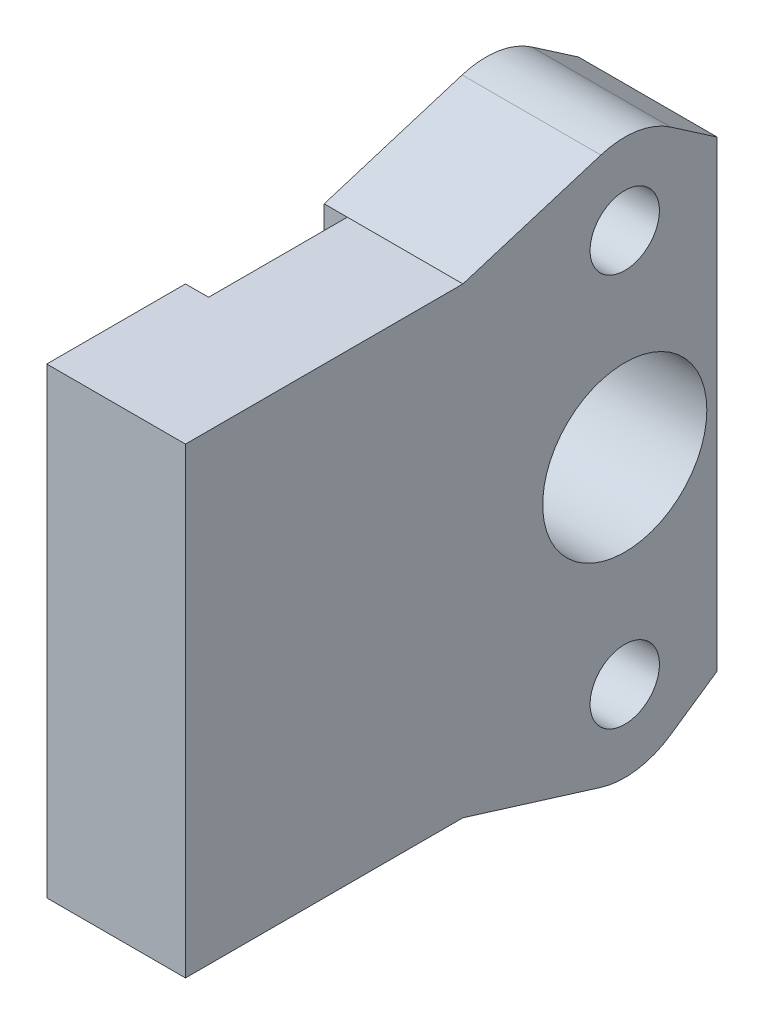
ISO-10303-21;
HEADER;
FILE_DESCRIPTION(('STEP AP214'),'2;1');
FILE_NAME('part.step','',(''),(''),'','','');
FILE_SCHEMA(('AUTOMOTIVE_DESIGN { 1 0 10303 214 1 1 1 1 }'));
ENDSEC;
DATA;
#1=APPLICATION_CONTEXT('core data for automotive mechanical design processes');
#2=APPLICATION_PROTOCOL_DEFINITION('international standard','automotive_design',2000,#1);
#3=PRODUCT_CONTEXT('',#1,'mechanical');
#4=PRODUCT('Part','Part','',(#3));
#5=PRODUCT_RELATED_PRODUCT_CATEGORY('part','',(#4));
#6=PRODUCT_DEFINITION_FORMATION('','',#4);
#7=PRODUCT_DEFINITION_CONTEXT('part definition',#1,'design');
#8=PRODUCT_DEFINITION('design','',#6,#7);
#9=PRODUCT_DEFINITION_SHAPE('','',#8);
#10=(LENGTH_UNIT() NAMED_UNIT(*) SI_UNIT(.MILLI.,.METRE.));
#11=(NAMED_UNIT(*) PLANE_ANGLE_UNIT() SI_UNIT($,.RADIAN.));
#12=(NAMED_UNIT(*) SI_UNIT($,.STERADIAN.) SOLID_ANGLE_UNIT());
#13=UNCERTAINTY_MEASURE_WITH_UNIT(LENGTH_MEASURE(1.E-05),#10,'distance_accuracy_value','');
#14=(GEOMETRIC_REPRESENTATION_CONTEXT(3) GLOBAL_UNCERTAINTY_ASSIGNED_CONTEXT((#13)) GLOBAL_UNIT_ASSIGNED_CONTEXT((#10,
#11,#12)) REPRESENTATION_CONTEXT('',''));
#15=CARTESIAN_POINT('',(0.,0.,0.));
#16=DIRECTION('',(0.,0.,1.));
#17=DIRECTION('',(1.,0.,0.));
#18=AXIS2_PLACEMENT_3D('',#15,#16,#17);
#19=CARTESIAN_POINT('',(0.,-8.5,0.));
#20=DIRECTION('',(1.,0.,0.));
#21=DIRECTION('',(0.,0.,-1.));
#22=AXIS2_PLACEMENT_3D('',#19,#20,#21);
#23=PLANE('',#22);
#24=DIRECTION('',(0.,0.,1.));
#25=VECTOR('',#24,1.);
#26=CARTESIAN_POINT('',(0.,10.,7.));
#27=LINE('',#26,#25);
#28=CARTESIAN_POINT('',(0.,10.,13.));
#29=VERTEX_POINT('',#28);
#30=CARTESIAN_POINT('',(0.,10.,19.));
#31=VERTEX_POINT('',#30);
#32=EDGE_CURVE('E146',#29,#31,#27,.T.);
#33=ORIENTED_EDGE('',*,*,#32,.F.);
#34=DIRECTION('',(0.,1.,0.));
#35=VECTOR('',#34,1.);
#36=CARTESIAN_POINT('',(0.,10.,13.));
#37=LINE('',#36,#35);
#38=CARTESIAN_POINT('',(0.,-10.,13.));
#39=VERTEX_POINT('',#38);
#40=EDGE_CURVE('E196',#39,#29,#37,.T.);
#41=ORIENTED_EDGE('',*,*,#40,.F.);
#42=DIRECTION('',(0.,0.,-1.));
#43=VECTOR('',#42,1.);
#44=CARTESIAN_POINT('',(0.,-10.,19.));
#45=LINE('',#44,#43);
#46=CARTESIAN_POINT('',(0.,-10.,19.));
#47=VERTEX_POINT('',#46);
#48=EDGE_CURVE('E151',#47,#39,#45,.T.);
#49=ORIENTED_EDGE('',*,*,#48,.F.);
#50=DIRECTION('',(0.,-1.,0.));
#51=VECTOR('',#50,1.);
#52=CARTESIAN_POINT('',(0.,10.,19.));
#53=LINE('',#52,#51);
#54=EDGE_CURVE('E148',#31,#47,#53,.T.);
#55=ORIENTED_EDGE('',*,*,#54,.F.);
#56=EDGE_LOOP('',(#33,#41,#49,#55));
#57=FACE_BOUND('',#56,.T.);
#58=ADVANCED_FACE('F33',(#57),#23,.F.);
#59=CARTESIAN_POINT('',(6.,-8.5,0.));
#60=DIRECTION('',(1.,0.,0.));
#61=DIRECTION('',(0.,0.,-1.));
#62=AXIS2_PLACEMENT_3D('',#59,#60,#61);
#63=PLANE('',#62);
#64=CARTESIAN_POINT('',(6.,-8.5,0.));
#65=DIRECTION('',(1.,0.,0.));
#66=DIRECTION('',(0.,0.,-1.));
#67=AXIS2_PLACEMENT_3D('',#64,#65,#66);
#68=CIRCLE('',#67,1.5);
#69=CARTESIAN_POINT('',(6.,-8.5,-1.50000000000001));
#70=VERTEX_POINT('',#69);
#71=EDGE_CURVE('E230',#70,#70,#68,.T.);
#72=ORIENTED_EDGE('',*,*,#71,.F.);
#73=EDGE_LOOP('',(#72));
#74=FACE_BOUND('',#73,.T.);
#75=DIRECTION('',(0.,0.,1.));
#76=VECTOR('',#75,1.);
#77=CARTESIAN_POINT('',(6.,10.,7.));
#78=LINE('',#77,#76);
#79=CARTESIAN_POINT('',(6.,10.,7.));
#80=VERTEX_POINT('',#79);
#81=CARTESIAN_POINT('',(6.,10.,19.));
#82=VERTEX_POINT('',#81);
#83=EDGE_CURVE('E167',#80,#82,#78,.T.);
#84=ORIENTED_EDGE('',*,*,#83,.T.);
#85=DIRECTION('',(0.,-1.,0.));
#86=VECTOR('',#85,1.);
#87=CARTESIAN_POINT('',(6.,10.,19.));
#88=LINE('',#87,#86);
#89=CARTESIAN_POINT('',(6.,-10.,19.));
#90=VERTEX_POINT('',#89);
#91=EDGE_CURVE('E99',#82,#90,#88,.T.);
#92=ORIENTED_EDGE('',*,*,#91,.T.);
#93=DIRECTION('',(0.,0.,-1.));
#94=VECTOR('',#93,1.);
#95=CARTESIAN_POINT('',(6.,-10.,19.));
#96=LINE('',#95,#94);
#97=CARTESIAN_POINT('',(6.,-10.,7.));
#98=VERTEX_POINT('',#97);
#99=EDGE_CURVE('E190',#90,#98,#96,.T.);
#100=ORIENTED_EDGE('',*,*,#99,.T.);
#101=DIRECTION('',(0.,-0.295268351266388,-0.955414360756855));
#102=VECTOR('',#101,1.);
#103=CARTESIAN_POINT('',(6.,-10.,7.));
#104=LINE('',#103,#102);
#105=CARTESIAN_POINT('',(6.,-11.843950262649,1.03343922943235));
#106=VERTEX_POINT('',#105);
#107=EDGE_CURVE('E243',#98,#106,#104,.T.);
#108=ORIENTED_EDGE('',*,*,#107,.T.);
#109=CARTESIAN_POINT('',(6.,-8.5,0.));
#110=DIRECTION('',(1.,0.,0.));
#111=DIRECTION('',(0.,0.,-1.));
#112=AXIS2_PLACEMENT_3D('',#109,#110,#111);
#113=CIRCLE('',#112,3.5);
#114=CARTESIAN_POINT('',(6.,-11.3859099396693,-1.98028377262402));
#115=VERTEX_POINT('',#114);
#116=EDGE_CURVE('E245',#106,#115,#113,.T.);
#117=ORIENTED_EDGE('',*,*,#116,.T.);
#118=DIRECTION('',(0.,0.565795363606862,-0.824545697048368));
#119=VECTOR('',#118,1.);
#120=CARTESIAN_POINT('',(6.,-11.3859099396693,-1.98028377262402));
#121=LINE('',#120,#119);
#122=CARTESIAN_POINT('',(6.,-10.,-4.));
#123=VERTEX_POINT('',#122);
#124=EDGE_CURVE('E247',#115,#123,#121,.T.);
#125=ORIENTED_EDGE('',*,*,#124,.T.);
#126=DIRECTION('',(0.,1.,0.));
#127=VECTOR('',#126,1.);
#128=CARTESIAN_POINT('',(6.,10.,-4.));
#129=LINE('',#128,#127);
#130=CARTESIAN_POINT('',(6.,10.,-4.));
#131=VERTEX_POINT('',#130);
#132=EDGE_CURVE('E128',#123,#131,#129,.T.);
#133=ORIENTED_EDGE('',*,*,#132,.T.);
#134=DIRECTION('',(0.,0.565795363606862,0.824545697048368));
#135=VECTOR('',#134,1.);
#136=CARTESIAN_POINT('',(6.,11.3859099396693,-1.98028377262402));
#137=LINE('',#136,#135);
#138=CARTESIAN_POINT('',(6.,11.3859099396693,-1.98028377262402));
#139=VERTEX_POINT('',#138);
#140=EDGE_CURVE('E121',#131,#139,#137,.T.);
#141=ORIENTED_EDGE('',*,*,#140,.T.);
#142=CARTESIAN_POINT('',(6.,8.5,0.));
#143=DIRECTION('',(1.,0.,0.));
#144=DIRECTION('',(0.,0.,1.));
#145=AXIS2_PLACEMENT_3D('',#142,#143,#144);
#146=CIRCLE('',#145,3.5);
#147=CARTESIAN_POINT('',(6.,11.843950262649,1.03343922943236));
#148=VERTEX_POINT('',#147);
#149=EDGE_CURVE('E126',#139,#148,#146,.T.);
#150=ORIENTED_EDGE('',*,*,#149,.T.);
#151=DIRECTION('',(0.,-0.295268351266388,0.955414360756854));
#152=VECTOR('',#151,1.);
#153=CARTESIAN_POINT('',(6.,10.,7.));
#154=LINE('',#153,#152);
#155=EDGE_CURVE('E57',#148,#80,#154,.T.);
#156=ORIENTED_EDGE('',*,*,#155,.T.);
#157=EDGE_LOOP('',(#84,#92,#100,#108,#117,#125,#133,#141,#150,#156));
#158=FACE_BOUND('',#157,.T.);
#159=CARTESIAN_POINT('',(6.,0.,0.));
#160=DIRECTION('',(1.,0.,0.));
#161=DIRECTION('',(0.,0.,-1.));
#162=AXIS2_PLACEMENT_3D('',#159,#160,#161);
#163=CIRCLE('',#162,3.55);
#164=CARTESIAN_POINT('',(6.,0.,-3.55));
#165=VERTEX_POINT('',#164);
#166=EDGE_CURVE('E149',#165,#165,#163,.T.);
#167=ORIENTED_EDGE('',*,*,#166,.F.);
#168=EDGE_LOOP('',(#167));
#169=FACE_BOUND('',#168,.T.);
#170=CARTESIAN_POINT('',(6.,8.5,0.));
#171=DIRECTION('',(1.,0.,0.));
#172=DIRECTION('',(0.,0.,-1.));
#173=AXIS2_PLACEMENT_3D('',#170,#171,#172);
#174=CIRCLE('',#173,1.5);
#175=CARTESIAN_POINT('',(6.,8.5,-1.5));
#176=VERTEX_POINT('',#175);
#177=EDGE_CURVE('E224',#176,#176,#174,.T.);
#178=ORIENTED_EDGE('',*,*,#177,.F.);
#179=EDGE_LOOP('',(#178));
#180=FACE_BOUND('',#179,.T.);
#181=ADVANCED_FACE('F123',(#74,#158,#169,#180),#63,.T.);
#182=CARTESIAN_POINT('',(0.,-8.5,0.));
#183=DIRECTION('',(1.,0.,0.));
#184=DIRECTION('',(0.,0.,-1.));
#185=AXIS2_PLACEMENT_3D('',#182,#183,#184);
#186=CIRCLE('',#185,1.5);
#187=CARTESIAN_POINT('',(0.,-8.5,-1.50000000000001));
#188=VERTEX_POINT('',#187);
#189=EDGE_CURVE('E227',#188,#188,#186,.T.);
#190=ORIENTED_EDGE('',*,*,#189,.T.);
#191=EDGE_LOOP('',(#190));
#192=FACE_BOUND('',#191,.T.);
#193=DIRECTION('',(0.,-0.295268351266388,-0.955414360756855));
#194=VECTOR('',#193,1.);
#195=CARTESIAN_POINT('',(0.,-10.,7.));
#196=LINE('',#195,#194);
#197=CARTESIAN_POINT('',(0.,-10.,7.));
#198=VERTEX_POINT('',#197);
#199=CARTESIAN_POINT('',(0.,-11.843950262649,1.03343922943235));
#200=VERTEX_POINT('',#199);
#201=EDGE_CURVE('E154',#198,#200,#196,.T.);
#202=ORIENTED_EDGE('',*,*,#201,.F.);
#203=DIRECTION('',(0.,-1.,0.));
#204=VECTOR('',#203,1.);
#205=CARTESIAN_POINT('',(0.,10.,7.));
#206=LINE('',#205,#204);
#207=CARTESIAN_POINT('',(0.,10.,7.));
#208=VERTEX_POINT('',#207);
#209=EDGE_CURVE('E204',#208,#198,#206,.T.);
#210=ORIENTED_EDGE('',*,*,#209,.F.);
#211=DIRECTION('',(0.,-0.295268351266388,0.955414360756854));
#212=VECTOR('',#211,1.);
#213=CARTESIAN_POINT('',(0.,10.,7.));
#214=LINE('',#213,#212);
#215=CARTESIAN_POINT('',(0.,11.843950262649,1.03343922943236));
#216=VERTEX_POINT('',#215);
#217=EDGE_CURVE('E164',#216,#208,#214,.T.);
#218=ORIENTED_EDGE('',*,*,#217,.F.);
#219=CARTESIAN_POINT('',(0.,8.5,0.));
#220=DIRECTION('',(1.,0.,0.));
#221=DIRECTION('',(0.,0.,1.));
#222=AXIS2_PLACEMENT_3D('',#219,#220,#221);
#223=CIRCLE('',#222,3.5);
#224=CARTESIAN_POINT('',(0.,11.3859099396693,-1.98028377262402));
#225=VERTEX_POINT('',#224);
#226=EDGE_CURVE('E91',#225,#216,#223,.T.);
#227=ORIENTED_EDGE('',*,*,#226,.F.);
#228=DIRECTION('',(0.,0.565795363606862,0.824545697048368));
#229=VECTOR('',#228,1.);
#230=CARTESIAN_POINT('',(0.,11.3859099396693,-1.98028377262402));
#231=LINE('',#230,#229);
#232=CARTESIAN_POINT('',(0.,10.,-4.));
#233=VERTEX_POINT('',#232);
#234=EDGE_CURVE('E136',#233,#225,#231,.T.);
#235=ORIENTED_EDGE('',*,*,#234,.F.);
#236=DIRECTION('',(0.,1.,0.));
#237=VECTOR('',#236,1.);
#238=CARTESIAN_POINT('',(0.,10.,-4.));
#239=LINE('',#238,#237);
#240=CARTESIAN_POINT('',(0.,-10.,-4.));
#241=VERTEX_POINT('',#240);
#242=EDGE_CURVE('E160',#241,#233,#239,.T.);
#243=ORIENTED_EDGE('',*,*,#242,.F.);
#244=DIRECTION('',(0.,0.565795363606862,-0.824545697048368));
#245=VECTOR('',#244,1.);
#246=CARTESIAN_POINT('',(0.,-11.3859099396693,-1.98028377262402));
#247=LINE('',#246,#245);
#248=CARTESIAN_POINT('',(0.,-11.3859099396693,-1.98028377262402));
#249=VERTEX_POINT('',#248);
#250=EDGE_CURVE('E158',#249,#241,#247,.T.);
#251=ORIENTED_EDGE('',*,*,#250,.F.);
#252=CARTESIAN_POINT('',(0.,-8.5,0.));
#253=DIRECTION('',(1.,0.,0.));
#254=DIRECTION('',(0.,0.,-1.));
#255=AXIS2_PLACEMENT_3D('',#252,#253,#254);
#256=CIRCLE('',#255,3.5);
#257=EDGE_CURVE('E156',#200,#249,#256,.T.);
#258=ORIENTED_EDGE('',*,*,#257,.F.);
#259=EDGE_LOOP('',(#202,#210,#218,#227,#235,#243,#251,#258));
#260=FACE_BOUND('',#259,.T.);
#261=CARTESIAN_POINT('',(0.,0.,0.));
#262=DIRECTION('',(1.,0.,0.));
#263=DIRECTION('',(0.,0.,-1.));
#264=AXIS2_PLACEMENT_3D('',#261,#262,#263);
#265=CIRCLE('',#264,3.55);
#266=CARTESIAN_POINT('',(0.,0.,-3.55));
#267=VERTEX_POINT('',#266);
#268=EDGE_CURVE('E233',#267,#267,#265,.T.);
#269=ORIENTED_EDGE('',*,*,#268,.T.);
#270=EDGE_LOOP('',(#269));
#271=FACE_BOUND('',#270,.T.);
#272=CARTESIAN_POINT('',(0.,8.5,0.));
#273=DIRECTION('',(1.,0.,0.));
#274=DIRECTION('',(0.,0.,-1.));
#275=AXIS2_PLACEMENT_3D('',#272,#273,#274);
#276=CIRCLE('',#275,1.5);
#277=CARTESIAN_POINT('',(0.,8.5,-1.5));
#278=VERTEX_POINT('',#277);
#279=EDGE_CURVE('E215',#278,#278,#276,.T.);
#280=ORIENTED_EDGE('',*,*,#279,.T.);
#281=EDGE_LOOP('',(#280));
#282=FACE_BOUND('',#281,.T.);
#283=ADVANCED_FACE('F260',(#192,#260,#271,#282),#23,.F.);
#284=CARTESIAN_POINT('',(6.,10.,7.));
#285=DIRECTION('',(0.,-1.,0.));
#286=DIRECTION('',(0.,0.,-1.));
#287=AXIS2_PLACEMENT_3D('',#284,#285,#286);
#288=PLANE('',#287);
#289=DIRECTION('',(0.,0.,-1.));
#290=VECTOR('',#289,1.);
#291=CARTESIAN_POINT('',(1.,10.,13.));
#292=LINE('',#291,#290);
#293=CARTESIAN_POINT('',(1.,10.,13.));
#294=VERTEX_POINT('',#293);
#295=CARTESIAN_POINT('',(1.,10.,7.));
#296=VERTEX_POINT('',#295);
#297=EDGE_CURVE('E48',#294,#296,#292,.T.);
#298=ORIENTED_EDGE('',*,*,#297,.F.);
#299=DIRECTION('',(-1.,0.,0.));
#300=VECTOR('',#299,1.);
#301=CARTESIAN_POINT('',(1.,10.,13.));
#302=LINE('',#301,#300);
#303=EDGE_CURVE('E222',#294,#29,#302,.T.);
#304=ORIENTED_EDGE('',*,*,#303,.T.);
#305=ORIENTED_EDGE('',*,*,#32,.T.);
#306=DIRECTION('',(-1.,0.,0.));
#307=VECTOR('',#306,1.);
#308=CARTESIAN_POINT('',(6.,10.,19.));
#309=LINE('',#308,#307);
#310=EDGE_CURVE('E11',#82,#31,#309,.T.);
#311=ORIENTED_EDGE('',*,*,#310,.F.);
#312=ORIENTED_EDGE('',*,*,#83,.F.);
#313=DIRECTION('',(-1.,0.,0.));
#314=VECTOR('',#313,1.);
#315=CARTESIAN_POINT('',(6.,10.,7.));
#316=LINE('',#315,#314);
#317=EDGE_CURVE('E142',#80,#296,#316,.T.);
#318=ORIENTED_EDGE('',*,*,#317,.T.);
#319=EDGE_LOOP('',(#298,#304,#305,#311,#312,#318));
#320=FACE_BOUND('',#319,.T.);
#321=ADVANCED_FACE('F35',(#320),#288,.F.);
#322=CARTESIAN_POINT('',(6.,10.,19.));
#323=DIRECTION('',(0.,0.,-1.));
#324=DIRECTION('',(-1.,0.,0.));
#325=AXIS2_PLACEMENT_3D('',#322,#323,#324);
#326=PLANE('',#325);
#327=ORIENTED_EDGE('',*,*,#54,.T.);
#328=DIRECTION('',(-1.,0.,0.));
#329=VECTOR('',#328,1.);
#330=CARTESIAN_POINT('',(6.,-10.,19.));
#331=LINE('',#330,#329);
#332=EDGE_CURVE('E41',#90,#47,#331,.T.);
#333=ORIENTED_EDGE('',*,*,#332,.F.);
#334=ORIENTED_EDGE('',*,*,#91,.F.);
#335=ORIENTED_EDGE('',*,*,#310,.T.);
#336=EDGE_LOOP('',(#327,#333,#334,#335));
#337=FACE_BOUND('',#336,.T.);
#338=ADVANCED_FACE('F291',(#337),#326,.F.);
#339=CARTESIAN_POINT('',(6.,-10.,19.));
#340=DIRECTION('',(0.,1.,0.));
#341=DIRECTION('',(0.,0.,1.));
#342=AXIS2_PLACEMENT_3D('',#339,#340,#341);
#343=PLANE('',#342);
#344=ORIENTED_EDGE('',*,*,#48,.T.);
#345=DIRECTION('',(-1.,0.,0.));
#346=VECTOR('',#345,1.);
#347=CARTESIAN_POINT('',(1.,-10.,13.));
#348=LINE('',#347,#346);
#349=CARTESIAN_POINT('',(1.,-10.,13.));
#350=VERTEX_POINT('',#349);
#351=EDGE_CURVE('E213',#350,#39,#348,.T.);
#352=ORIENTED_EDGE('',*,*,#351,.F.);
#353=DIRECTION('',(0.,0.,1.));
#354=VECTOR('',#353,1.);
#355=CARTESIAN_POINT('',(1.,-10.,13.));
#356=LINE('',#355,#354);
#357=CARTESIAN_POINT('',(1.,-10.,7.));
#358=VERTEX_POINT('',#357);
#359=EDGE_CURVE('E210',#358,#350,#356,.T.);
#360=ORIENTED_EDGE('',*,*,#359,.F.);
#361=DIRECTION('',(-1.,0.,0.));
#362=VECTOR('',#361,1.);
#363=CARTESIAN_POINT('',(6.,-10.,7.));
#364=LINE('',#363,#362);
#365=EDGE_CURVE('E181',#98,#358,#364,.T.);
#366=ORIENTED_EDGE('',*,*,#365,.F.);
#367=ORIENTED_EDGE('',*,*,#99,.F.);
#368=ORIENTED_EDGE('',*,*,#332,.T.);
#369=EDGE_LOOP('',(#344,#352,#360,#366,#367,#368));
#370=FACE_BOUND('',#369,.T.);
#371=ADVANCED_FACE('F187',(#370),#343,.F.);
#372=CARTESIAN_POINT('',(6.,-10.,7.));
#373=DIRECTION('',(0.,0.955414360756854,-0.295268351266388));
#374=DIRECTION('',(0.,0.295268351266388,0.955414360756855));
#375=AXIS2_PLACEMENT_3D('',#372,#373,#374);
#376=PLANE('',#375);
#377=ORIENTED_EDGE('',*,*,#201,.T.);
#378=DIRECTION('',(-1.,0.,0.));
#379=VECTOR('',#378,1.);
#380=CARTESIAN_POINT('',(6.,-11.843950262649,1.03343922943235));
#381=LINE('',#380,#379);
#382=EDGE_CURVE('E178',#106,#200,#381,.T.);
#383=ORIENTED_EDGE('',*,*,#382,.F.);
#384=ORIENTED_EDGE('',*,*,#107,.F.);
#385=ORIENTED_EDGE('',*,*,#365,.T.);
#386=DIRECTION('',(-1.,0.,0.));
#387=VECTOR('',#386,1.);
#388=CARTESIAN_POINT('',(1.,-10.,7.));
#389=LINE('',#388,#387);
#390=EDGE_CURVE('E216',#358,#198,#389,.T.);
#391=ORIENTED_EDGE('',*,*,#390,.T.);
#392=EDGE_LOOP('',(#377,#383,#384,#385,#391));
#393=FACE_BOUND('',#392,.T.);
#394=ADVANCED_FACE('F288',(#393),#376,.F.);
#395=CARTESIAN_POINT('',(6.,-8.5,0.));
#396=DIRECTION('',(-1.,0.,0.));
#397=DIRECTION('',(0.,0.,1.));
#398=AXIS2_PLACEMENT_3D('',#395,#396,#397);
#399=CYLINDRICAL_SURFACE('',#398,3.5);
#400=ORIENTED_EDGE('',*,*,#257,.T.);
#401=DIRECTION('',(-1.,0.,0.));
#402=VECTOR('',#401,1.);
#403=CARTESIAN_POINT('',(6.,-11.3859099396693,-1.98028377262402));
#404=LINE('',#403,#402);
#405=EDGE_CURVE('E175',#115,#249,#404,.T.);
#406=ORIENTED_EDGE('',*,*,#405,.F.);
#407=ORIENTED_EDGE('',*,*,#116,.F.);
#408=ORIENTED_EDGE('',*,*,#382,.T.);
#409=EDGE_LOOP('',(#400,#406,#407,#408));
#410=FACE_BOUND('',#409,.T.);
#411=ADVANCED_FACE('F381',(#410),#399,.T.);
#412=CARTESIAN_POINT('',(6.,-11.3859099396693,-1.98028377262402));
#413=DIRECTION('',(0.,0.824545697048368,0.565795363606862));
#414=DIRECTION('',(0.,-0.565795363606862,0.824545697048368));
#415=AXIS2_PLACEMENT_3D('',#412,#413,#414);
#416=PLANE('',#415);
#417=ORIENTED_EDGE('',*,*,#250,.T.);
#418=DIRECTION('',(-1.,0.,0.));
#419=VECTOR('',#418,1.);
#420=CARTESIAN_POINT('',(6.,-10.,-4.));
#421=LINE('',#420,#419);
#422=EDGE_CURVE('E172',#123,#241,#421,.T.);
#423=ORIENTED_EDGE('',*,*,#422,.F.);
#424=ORIENTED_EDGE('',*,*,#124,.F.);
#425=ORIENTED_EDGE('',*,*,#405,.T.);
#426=EDGE_LOOP('',(#417,#423,#424,#425));
#427=FACE_BOUND('',#426,.T.);
#428=ADVANCED_FACE('F253',(#427),#416,.F.);
#429=CARTESIAN_POINT('',(6.,10.,-4.));
#430=DIRECTION('',(0.,0.,1.));
#431=DIRECTION('',(0.,-1.,0.));
#432=AXIS2_PLACEMENT_3D('',#429,#430,#431);
#433=PLANE('',#432);
#434=ORIENTED_EDGE('',*,*,#242,.T.);
#435=DIRECTION('',(-1.,0.,0.));
#436=VECTOR('',#435,1.);
#437=CARTESIAN_POINT('',(6.,10.,-4.));
#438=LINE('',#437,#436);
#439=EDGE_CURVE('E137',#131,#233,#438,.T.);
#440=ORIENTED_EDGE('',*,*,#439,.F.);
#441=ORIENTED_EDGE('',*,*,#132,.F.);
#442=ORIENTED_EDGE('',*,*,#422,.T.);
#443=EDGE_LOOP('',(#434,#440,#441,#442));
#444=FACE_BOUND('',#443,.T.);
#445=ADVANCED_FACE('F257',(#444),#433,.F.);
#446=CARTESIAN_POINT('',(6.,11.3859099396693,-1.98028377262402));
#447=DIRECTION('',(0.,-0.824545697048367,0.565795363606862));
#448=DIRECTION('',(0.,-0.565795363606863,-0.824545697048368));
#449=AXIS2_PLACEMENT_3D('',#446,#447,#448);
#450=PLANE('',#449);
#451=ORIENTED_EDGE('',*,*,#234,.T.);
#452=DIRECTION('',(-1.,0.,0.));
#453=VECTOR('',#452,1.);
#454=CARTESIAN_POINT('',(6.,11.3859099396693,-1.98028377262402));
#455=LINE('',#454,#453);
#456=EDGE_CURVE('E133',#139,#225,#455,.T.);
#457=ORIENTED_EDGE('',*,*,#456,.F.);
#458=ORIENTED_EDGE('',*,*,#140,.F.);
#459=ORIENTED_EDGE('',*,*,#439,.T.);
#460=EDGE_LOOP('',(#451,#457,#458,#459));
#461=FACE_BOUND('',#460,.T.);
#462=ADVANCED_FACE('F134',(#461),#450,.F.);
#463=CARTESIAN_POINT('',(6.,8.5,0.));
#464=DIRECTION('',(-1.,0.,0.));
#465=DIRECTION('',(0.,0.,1.));
#466=AXIS2_PLACEMENT_3D('',#463,#464,#465);
#467=CYLINDRICAL_SURFACE('',#466,3.5);
#468=ORIENTED_EDGE('',*,*,#226,.T.);
#469=DIRECTION('',(-1.,0.,0.));
#470=VECTOR('',#469,1.);
#471=CARTESIAN_POINT('',(6.,11.843950262649,1.03343922943236));
#472=LINE('',#471,#470);
#473=EDGE_CURVE('E138',#148,#216,#472,.T.);
#474=ORIENTED_EDGE('',*,*,#473,.F.);
#475=ORIENTED_EDGE('',*,*,#149,.F.);
#476=ORIENTED_EDGE('',*,*,#456,.T.);
#477=EDGE_LOOP('',(#468,#474,#475,#476));
#478=FACE_BOUND('',#477,.T.);
#479=ADVANCED_FACE('F140',(#478),#467,.T.);
#480=CARTESIAN_POINT('',(6.,10.,7.));
#481=DIRECTION('',(0.,-0.955414360756854,-0.295268351266388));
#482=DIRECTION('',(0.,0.295268351266388,-0.955414360756854));
#483=AXIS2_PLACEMENT_3D('',#480,#481,#482);
#484=PLANE('',#483);
#485=ORIENTED_EDGE('',*,*,#217,.T.);
#486=DIRECTION('',(-1.,0.,0.));
#487=VECTOR('',#486,1.);
#488=CARTESIAN_POINT('',(1.,10.,7.));
#489=LINE('',#488,#487);
#490=EDGE_CURVE('E219',#296,#208,#489,.T.);
#491=ORIENTED_EDGE('',*,*,#490,.F.);
#492=ORIENTED_EDGE('',*,*,#317,.F.);
#493=ORIENTED_EDGE('',*,*,#155,.F.);
#494=ORIENTED_EDGE('',*,*,#473,.T.);
#495=EDGE_LOOP('',(#485,#491,#492,#493,#494));
#496=FACE_BOUND('',#495,.T.);
#497=ADVANCED_FACE('F267',(#496),#484,.F.);
#498=CARTESIAN_POINT('',(6.,0.,0.));
#499=DIRECTION('',(-1.,0.,0.));
#500=DIRECTION('',(0.,0.,1.));
#501=AXIS2_PLACEMENT_3D('',#498,#499,#500);
#502=CYLINDRICAL_SURFACE('',#501,3.55);
#503=ORIENTED_EDGE('',*,*,#166,.T.);
#504=EDGE_LOOP('',(#503));
#505=FACE_BOUND('',#504,.T.);
#506=ORIENTED_EDGE('',*,*,#268,.F.);
#507=EDGE_LOOP('',(#506));
#508=FACE_BOUND('',#507,.T.);
#509=ADVANCED_FACE('F315',(#505,#508),#502,.F.);
#510=CARTESIAN_POINT('',(6.,-8.5,0.));
#511=DIRECTION('',(-1.,0.,0.));
#512=DIRECTION('',(0.,0.,1.));
#513=AXIS2_PLACEMENT_3D('',#510,#511,#512);
#514=CYLINDRICAL_SURFACE('',#513,1.5);
#515=ORIENTED_EDGE('',*,*,#71,.T.);
#516=EDGE_LOOP('',(#515));
#517=FACE_BOUND('',#516,.T.);
#518=ORIENTED_EDGE('',*,*,#189,.F.);
#519=EDGE_LOOP('',(#518));
#520=FACE_BOUND('',#519,.T.);
#521=ADVANCED_FACE('F312',(#517,#520),#514,.F.);
#522=CARTESIAN_POINT('',(6.,8.5,0.));
#523=DIRECTION('',(-1.,0.,0.));
#524=DIRECTION('',(0.,0.,1.));
#525=AXIS2_PLACEMENT_3D('',#522,#523,#524);
#526=CYLINDRICAL_SURFACE('',#525,1.5);
#527=ORIENTED_EDGE('',*,*,#177,.T.);
#528=EDGE_LOOP('',(#527));
#529=FACE_BOUND('',#528,.T.);
#530=ORIENTED_EDGE('',*,*,#279,.F.);
#531=EDGE_LOOP('',(#530));
#532=FACE_BOUND('',#531,.T.);
#533=ADVANCED_FACE('F314',(#529,#532),#526,.F.);
#534=CARTESIAN_POINT('',(1.,10.,13.));
#535=DIRECTION('',(0.,0.,1.));
#536=DIRECTION('',(0.,-1.,0.));
#537=AXIS2_PLACEMENT_3D('',#534,#535,#536);
#538=PLANE('',#537);
#539=ORIENTED_EDGE('',*,*,#40,.T.);
#540=ORIENTED_EDGE('',*,*,#303,.F.);
#541=DIRECTION('',(0.,1.,0.));
#542=VECTOR('',#541,1.);
#543=CARTESIAN_POINT('',(1.,10.,13.));
#544=LINE('',#543,#542);
#545=EDGE_CURVE('E207',#350,#294,#544,.T.);
#546=ORIENTED_EDGE('',*,*,#545,.F.);
#547=ORIENTED_EDGE('',*,*,#351,.T.);
#548=EDGE_LOOP('',(#539,#540,#546,#547));
#549=FACE_BOUND('',#548,.T.);
#550=ADVANCED_FACE('F277',(#549),#538,.F.);
#551=CARTESIAN_POINT('',(1.,10.,7.));
#552=DIRECTION('',(0.,0.,-1.));
#553=DIRECTION('',(0.,1.,0.));
#554=AXIS2_PLACEMENT_3D('',#551,#552,#553);
#555=PLANE('',#554);
#556=ORIENTED_EDGE('',*,*,#209,.T.);
#557=ORIENTED_EDGE('',*,*,#390,.F.);
#558=DIRECTION('',(0.,-1.,0.));
#559=VECTOR('',#558,1.);
#560=CARTESIAN_POINT('',(1.,10.,7.));
#561=LINE('',#560,#559);
#562=EDGE_CURVE('E284',#296,#358,#561,.T.);
#563=ORIENTED_EDGE('',*,*,#562,.F.);
#564=ORIENTED_EDGE('',*,*,#490,.T.);
#565=EDGE_LOOP('',(#556,#557,#563,#564));
#566=FACE_BOUND('',#565,.T.);
#567=ADVANCED_FACE('F329',(#566),#555,.F.);
#568=CARTESIAN_POINT('',(1.,0.,0.));
#569=DIRECTION('',(1.,0.,0.));
#570=DIRECTION('',(0.,0.,-1.));
#571=AXIS2_PLACEMENT_3D('',#568,#569,#570);
#572=PLANE('',#571);
#573=ORIENTED_EDGE('',*,*,#545,.T.);
#574=ORIENTED_EDGE('',*,*,#297,.T.);
#575=ORIENTED_EDGE('',*,*,#562,.T.);
#576=ORIENTED_EDGE('',*,*,#359,.T.);
#577=EDGE_LOOP('',(#573,#574,#575,#576));
#578=FACE_BOUND('',#577,.T.);
#579=ADVANCED_FACE('F280',(#578),#572,.F.);
#580=CLOSED_SHELL('',(#58,#181,#283,#321,#338,#371,#394,#411,#428,#445,#462,#479,#497,#509,#521,
#533,#550,#567,#579));
#581=MANIFOLD_SOLID_BREP('B2',#580);
#582=ADVANCED_BREP_SHAPE_REPRESENTATION('',(#18,#581),#14);
#583=SHAPE_DEFINITION_REPRESENTATION(#9,#582);
ENDSEC;
END-ISO-10303-21;
